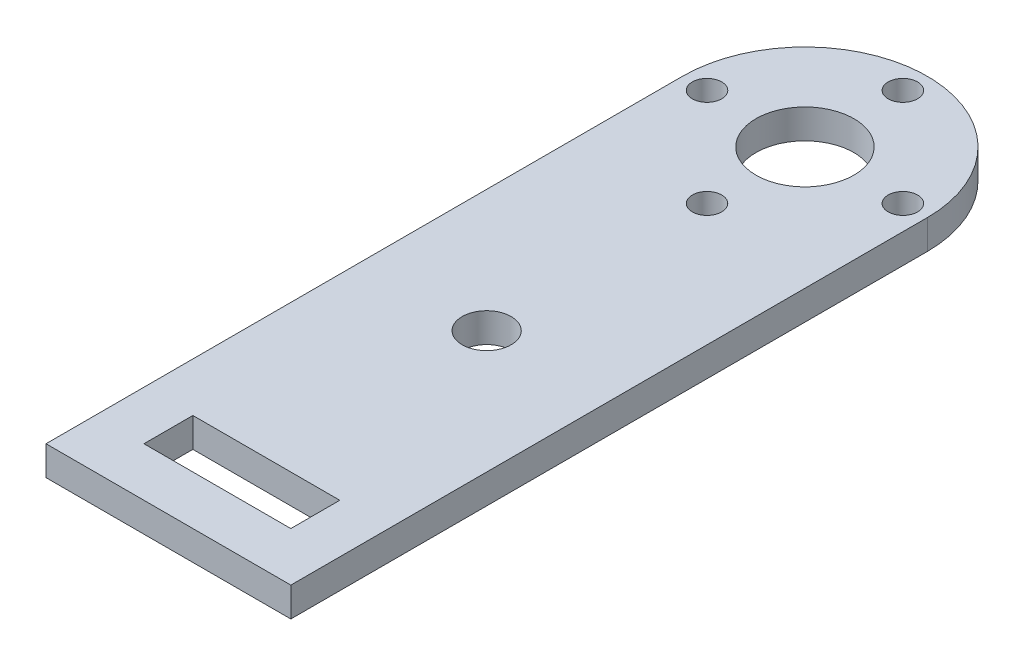
ISO-10303-21;
HEADER;
FILE_DESCRIPTION(('STEP AP214'),'2;1');
FILE_NAME('part.step','',(''),(''),'','','');
FILE_SCHEMA(('AUTOMOTIVE_DESIGN { 1 0 10303 214 1 1 1 1 }'));
ENDSEC;
DATA;
#1=APPLICATION_CONTEXT('core data for automotive mechanical design processes');
#2=APPLICATION_PROTOCOL_DEFINITION('international standard','automotive_design',2000,#1);
#3=PRODUCT_CONTEXT('',#1,'mechanical');
#4=PRODUCT('Part','Part','',(#3));
#5=PRODUCT_RELATED_PRODUCT_CATEGORY('part','',(#4));
#6=PRODUCT_DEFINITION_FORMATION('','',#4);
#7=PRODUCT_DEFINITION_CONTEXT('part definition',#1,'design');
#8=PRODUCT_DEFINITION('design','',#6,#7);
#9=PRODUCT_DEFINITION_SHAPE('','',#8);
#10=(LENGTH_UNIT() NAMED_UNIT(*) SI_UNIT(.MILLI.,.METRE.));
#11=(NAMED_UNIT(*) PLANE_ANGLE_UNIT() SI_UNIT($,.RADIAN.));
#12=(NAMED_UNIT(*) SI_UNIT($,.STERADIAN.) SOLID_ANGLE_UNIT());
#13=UNCERTAINTY_MEASURE_WITH_UNIT(LENGTH_MEASURE(1.E-05),#10,'distance_accuracy_value','');
#14=(GEOMETRIC_REPRESENTATION_CONTEXT(3) GLOBAL_UNCERTAINTY_ASSIGNED_CONTEXT((#13)) GLOBAL_UNIT_ASSIGNED_CONTEXT((#10,
#11,#12)) REPRESENTATION_CONTEXT('',''));
#15=CARTESIAN_POINT('',(0.,0.,0.));
#16=DIRECTION('',(0.,0.,1.));
#17=DIRECTION('',(1.,0.,0.));
#18=AXIS2_PLACEMENT_3D('',#15,#16,#17);
#19=CARTESIAN_POINT('',(1.25,0.3,-6.5));
#20=DIRECTION('',(0.,-1.,0.));
#21=DIRECTION('',(0.,0.,-1.));
#22=AXIS2_PLACEMENT_3D('',#19,#20,#21);
#23=PLANE('',#22);
#24=CARTESIAN_POINT('',(1.25,0.3,-3.25));
#25=DIRECTION('',(0.,1.,0.));
#26=DIRECTION('',(0.,0.,1.));
#27=AXIS2_PLACEMENT_3D('',#24,#25,#26);
#28=CIRCLE('',#27,0.25);
#29=CARTESIAN_POINT('',(1.25,0.3,-3.));
#30=VERTEX_POINT('',#29);
#31=EDGE_CURVE('E259',#30,#30,#28,.T.);
#32=ORIENTED_EDGE('',*,*,#31,.F.);
#33=EDGE_LOOP('',(#32));
#34=FACE_BOUND('',#33,.T.);
#35=CARTESIAN_POINT('',(1.24999999999999,0.3,-7.5));
#36=DIRECTION('',(0.,1.,0.));
#37=DIRECTION('',(-1.,0.,0.));
#38=AXIS2_PLACEMENT_3D('',#35,#36,#37);
#39=CIRCLE('',#38,0.15);
#40=CARTESIAN_POINT('',(1.09999999999999,0.3,-7.5));
#41=VERTEX_POINT('',#40);
#42=EDGE_CURVE('E261',#41,#41,#39,.T.);
#43=ORIENTED_EDGE('',*,*,#42,.F.);
#44=EDGE_LOOP('',(#43));
#45=FACE_BOUND('',#44,.T.);
#46=CARTESIAN_POINT('',(2.25,0.3,-6.5));
#47=DIRECTION('',(0.,1.,0.));
#48=DIRECTION('',(0.,0.,-1.));
#49=AXIS2_PLACEMENT_3D('',#46,#47,#48);
#50=CIRCLE('',#49,0.15);
#51=CARTESIAN_POINT('',(2.25,0.3,-6.65));
#52=VERTEX_POINT('',#51);
#53=EDGE_CURVE('E267',#52,#52,#50,.T.);
#54=ORIENTED_EDGE('',*,*,#53,.F.);
#55=EDGE_LOOP('',(#54));
#56=FACE_BOUND('',#55,.T.);
#57=CARTESIAN_POINT('',(1.25,0.3,-5.5));
#58=DIRECTION('',(0.,1.,0.));
#59=DIRECTION('',(1.,0.,0.));
#60=AXIS2_PLACEMENT_3D('',#57,#58,#59);
#61=CIRCLE('',#60,0.15);
#62=CARTESIAN_POINT('',(1.4,0.3,-5.5));
#63=VERTEX_POINT('',#62);
#64=EDGE_CURVE('E273',#63,#63,#61,.T.);
#65=ORIENTED_EDGE('',*,*,#64,.F.);
#66=EDGE_LOOP('',(#65));
#67=FACE_BOUND('',#66,.T.);
#68=CARTESIAN_POINT('',(0.25,0.3,-6.5));
#69=DIRECTION('',(0.,1.,0.));
#70=DIRECTION('',(0.,0.,1.));
#71=AXIS2_PLACEMENT_3D('',#68,#69,#70);
#72=CIRCLE('',#71,0.15);
#73=CARTESIAN_POINT('',(0.25,0.3,-6.35));
#74=VERTEX_POINT('',#73);
#75=EDGE_CURVE('E279',#74,#74,#72,.T.);
#76=ORIENTED_EDGE('',*,*,#75,.F.);
#77=EDGE_LOOP('',(#76));
#78=FACE_BOUND('',#77,.T.);
#79=CARTESIAN_POINT('',(1.25,0.3,-6.5));
#80=DIRECTION('',(0.,1.,0.));
#81=DIRECTION('',(0.,0.,1.));
#82=AXIS2_PLACEMENT_3D('',#79,#80,#81);
#83=CIRCLE('',#82,0.5);
#84=CARTESIAN_POINT('',(1.25,0.3,-6.));
#85=VERTEX_POINT('',#84);
#86=EDGE_CURVE('E138',#85,#85,#83,.T.);
#87=ORIENTED_EDGE('',*,*,#86,.F.);
#88=EDGE_LOOP('',(#87));
#89=FACE_BOUND('',#88,.T.);
#90=DIRECTION('',(0.,0.,1.));
#91=VECTOR('',#90,1.);
#92=CARTESIAN_POINT('',(0.,0.3,0.));
#93=LINE('',#92,#91);
#94=CARTESIAN_POINT('',(0.,0.3,-6.5));
#95=VERTEX_POINT('',#94);
#96=CARTESIAN_POINT('',(0.,0.3,0.));
#97=VERTEX_POINT('',#96);
#98=EDGE_CURVE('E144',#95,#97,#93,.T.);
#99=ORIENTED_EDGE('',*,*,#98,.T.);
#100=DIRECTION('',(1.,0.,0.));
#101=VECTOR('',#100,1.);
#102=CARTESIAN_POINT('',(0.,0.3,0.));
#103=LINE('',#102,#101);
#104=CARTESIAN_POINT('',(2.5,0.3,0.));
#105=VERTEX_POINT('',#104);
#106=EDGE_CURVE('E147',#97,#105,#103,.T.);
#107=ORIENTED_EDGE('',*,*,#106,.T.);
#108=DIRECTION('',(0.,0.,-1.));
#109=VECTOR('',#108,1.);
#110=CARTESIAN_POINT('',(2.5,0.3,0.));
#111=LINE('',#110,#109);
#112=CARTESIAN_POINT('',(2.5,0.3,-6.5));
#113=VERTEX_POINT('',#112);
#114=EDGE_CURVE('E150',#105,#113,#111,.T.);
#115=ORIENTED_EDGE('',*,*,#114,.T.);
#116=CARTESIAN_POINT('',(1.25,0.3,-6.5));
#117=DIRECTION('',(0.,1.,0.));
#118=DIRECTION('',(0.,0.,-1.));
#119=AXIS2_PLACEMENT_3D('',#116,#117,#118);
#120=CIRCLE('',#119,1.25);
#121=EDGE_CURVE('E152',#113,#95,#120,.T.);
#122=ORIENTED_EDGE('',*,*,#121,.T.);
#123=EDGE_LOOP('',(#99,#107,#115,#122));
#124=FACE_BOUND('',#123,.T.);
#125=DIRECTION('',(0.,0.,1.));
#126=VECTOR('',#125,1.);
#127=CARTESIAN_POINT('',(0.5,0.3,-0.5));
#128=LINE('',#127,#126);
#129=CARTESIAN_POINT('',(0.5,0.3,-1.));
#130=VERTEX_POINT('',#129);
#131=CARTESIAN_POINT('',(0.5,0.3,-0.5));
#132=VERTEX_POINT('',#131);
#133=EDGE_CURVE('E100',#130,#132,#128,.T.);
#134=ORIENTED_EDGE('',*,*,#133,.F.);
#135=DIRECTION('',(-1.,0.,0.));
#136=VECTOR('',#135,1.);
#137=CARTESIAN_POINT('',(2.,0.3,-1.));
#138=LINE('',#137,#136);
#139=CARTESIAN_POINT('',(2.,0.3,-1.));
#140=VERTEX_POINT('',#139);
#141=EDGE_CURVE('E122',#140,#130,#138,.T.);
#142=ORIENTED_EDGE('',*,*,#141,.F.);
#143=DIRECTION('',(0.,0.,-1.));
#144=VECTOR('',#143,1.);
#145=CARTESIAN_POINT('',(2.,0.3,-0.5));
#146=LINE('',#145,#144);
#147=CARTESIAN_POINT('',(2.,0.3,-0.5));
#148=VERTEX_POINT('',#147);
#149=EDGE_CURVE('E120',#148,#140,#146,.T.);
#150=ORIENTED_EDGE('',*,*,#149,.F.);
#151=DIRECTION('',(1.,0.,0.));
#152=VECTOR('',#151,1.);
#153=CARTESIAN_POINT('',(2.,0.3,-0.5));
#154=LINE('',#153,#152);
#155=EDGE_CURVE('E108',#132,#148,#154,.T.);
#156=ORIENTED_EDGE('',*,*,#155,.F.);
#157=EDGE_LOOP('',(#134,#142,#150,#156));
#158=FACE_BOUND('',#157,.T.);
#159=ADVANCED_FACE('F35',(#34,#45,#56,#67,#78,#89,#124,#158),#23,.F.);
#160=CARTESIAN_POINT('',(1.25,0.,-6.5));
#161=DIRECTION('',(0.,-1.,0.));
#162=DIRECTION('',(0.,0.,-1.));
#163=AXIS2_PLACEMENT_3D('',#160,#161,#162);
#164=PLANE('',#163);
#165=CARTESIAN_POINT('',(1.25,0.,-3.25));
#166=DIRECTION('',(0.,1.,0.));
#167=DIRECTION('',(0.,0.,1.));
#168=AXIS2_PLACEMENT_3D('',#165,#166,#167);
#169=CIRCLE('',#168,0.25);
#170=CARTESIAN_POINT('',(1.25,0.,-3.));
#171=VERTEX_POINT('',#170);
#172=EDGE_CURVE('E257',#171,#171,#169,.T.);
#173=ORIENTED_EDGE('',*,*,#172,.T.);
#174=EDGE_LOOP('',(#173));
#175=FACE_BOUND('',#174,.T.);
#176=CARTESIAN_POINT('',(1.24999999999999,0.,-7.5));
#177=DIRECTION('',(0.,1.,0.));
#178=DIRECTION('',(-1.,0.,0.));
#179=AXIS2_PLACEMENT_3D('',#176,#177,#178);
#180=CIRCLE('',#179,0.15);
#181=CARTESIAN_POINT('',(1.09999999999999,0.,-7.5));
#182=VERTEX_POINT('',#181);
#183=EDGE_CURVE('E264',#182,#182,#180,.T.);
#184=ORIENTED_EDGE('',*,*,#183,.T.);
#185=EDGE_LOOP('',(#184));
#186=FACE_BOUND('',#185,.T.);
#187=CARTESIAN_POINT('',(2.25,0.,-6.5));
#188=DIRECTION('',(0.,1.,0.));
#189=DIRECTION('',(0.,0.,-1.));
#190=AXIS2_PLACEMENT_3D('',#187,#188,#189);
#191=CIRCLE('',#190,0.15);
#192=CARTESIAN_POINT('',(2.25,0.,-6.65));
#193=VERTEX_POINT('',#192);
#194=EDGE_CURVE('E270',#193,#193,#191,.T.);
#195=ORIENTED_EDGE('',*,*,#194,.T.);
#196=EDGE_LOOP('',(#195));
#197=FACE_BOUND('',#196,.T.);
#198=CARTESIAN_POINT('',(1.25,0.,-5.5));
#199=DIRECTION('',(0.,1.,0.));
#200=DIRECTION('',(1.,0.,0.));
#201=AXIS2_PLACEMENT_3D('',#198,#199,#200);
#202=CIRCLE('',#201,0.15);
#203=CARTESIAN_POINT('',(1.4,0.,-5.5));
#204=VERTEX_POINT('',#203);
#205=EDGE_CURVE('E276',#204,#204,#202,.T.);
#206=ORIENTED_EDGE('',*,*,#205,.T.);
#207=EDGE_LOOP('',(#206));
#208=FACE_BOUND('',#207,.T.);
#209=CARTESIAN_POINT('',(0.25,0.,-6.5));
#210=DIRECTION('',(0.,1.,0.));
#211=DIRECTION('',(0.,0.,1.));
#212=AXIS2_PLACEMENT_3D('',#209,#210,#211);
#213=CIRCLE('',#212,0.15);
#214=CARTESIAN_POINT('',(0.25,0.,-6.35));
#215=VERTEX_POINT('',#214);
#216=EDGE_CURVE('E128',#215,#215,#213,.T.);
#217=ORIENTED_EDGE('',*,*,#216,.T.);
#218=EDGE_LOOP('',(#217));
#219=FACE_BOUND('',#218,.T.);
#220=CARTESIAN_POINT('',(1.25,0.,-6.5));
#221=DIRECTION('',(0.,1.,0.));
#222=DIRECTION('',(0.,0.,1.));
#223=AXIS2_PLACEMENT_3D('',#220,#221,#222);
#224=CIRCLE('',#223,0.5);
#225=CARTESIAN_POINT('',(1.25,0.,-6.));
#226=VERTEX_POINT('',#225);
#227=EDGE_CURVE('E116',#226,#226,#224,.T.);
#228=ORIENTED_EDGE('',*,*,#227,.T.);
#229=EDGE_LOOP('',(#228));
#230=FACE_BOUND('',#229,.T.);
#231=DIRECTION('',(0.,0.,1.));
#232=VECTOR('',#231,1.);
#233=CARTESIAN_POINT('',(0.,0.,0.));
#234=LINE('',#233,#232);
#235=CARTESIAN_POINT('',(0.,0.,-6.5));
#236=VERTEX_POINT('',#235);
#237=CARTESIAN_POINT('',(0.,0.,0.));
#238=VERTEX_POINT('',#237);
#239=EDGE_CURVE('E141',#236,#238,#234,.T.);
#240=ORIENTED_EDGE('',*,*,#239,.F.);
#241=CARTESIAN_POINT('',(1.25,0.,-6.5));
#242=DIRECTION('',(0.,1.,0.));
#243=DIRECTION('',(0.,0.,-1.));
#244=AXIS2_PLACEMENT_3D('',#241,#242,#243);
#245=CIRCLE('',#244,1.25);
#246=CARTESIAN_POINT('',(2.5,0.,-6.5));
#247=VERTEX_POINT('',#246);
#248=EDGE_CURVE('E148',#247,#236,#245,.T.);
#249=ORIENTED_EDGE('',*,*,#248,.F.);
#250=DIRECTION('',(0.,0.,-1.));
#251=VECTOR('',#250,1.);
#252=CARTESIAN_POINT('',(2.5,0.,0.));
#253=LINE('',#252,#251);
#254=CARTESIAN_POINT('',(2.5,0.,0.));
#255=VERTEX_POINT('',#254);
#256=EDGE_CURVE('E159',#255,#247,#253,.T.);
#257=ORIENTED_EDGE('',*,*,#256,.F.);
#258=DIRECTION('',(1.,0.,0.));
#259=VECTOR('',#258,1.);
#260=CARTESIAN_POINT('',(0.,0.,0.));
#261=LINE('',#260,#259);
#262=EDGE_CURVE('E157',#238,#255,#261,.T.);
#263=ORIENTED_EDGE('',*,*,#262,.F.);
#264=EDGE_LOOP('',(#240,#249,#257,#263));
#265=FACE_BOUND('',#264,.T.);
#266=DIRECTION('',(-1.,0.,0.));
#267=VECTOR('',#266,1.);
#268=CARTESIAN_POINT('',(2.,0.,-1.));
#269=LINE('',#268,#267);
#270=CARTESIAN_POINT('',(2.,0.,-1.));
#271=VERTEX_POINT('',#270);
#272=CARTESIAN_POINT('',(0.5,0.,-1.));
#273=VERTEX_POINT('',#272);
#274=EDGE_CURVE('E109',#271,#273,#269,.T.);
#275=ORIENTED_EDGE('',*,*,#274,.T.);
#276=DIRECTION('',(0.,0.,1.));
#277=VECTOR('',#276,1.);
#278=CARTESIAN_POINT('',(0.5,0.,-0.5));
#279=LINE('',#278,#277);
#280=CARTESIAN_POINT('',(0.5,0.,-0.5));
#281=VERTEX_POINT('',#280);
#282=EDGE_CURVE('E58',#273,#281,#279,.T.);
#283=ORIENTED_EDGE('',*,*,#282,.T.);
#284=DIRECTION('',(1.,0.,0.));
#285=VECTOR('',#284,1.);
#286=CARTESIAN_POINT('',(2.,0.,-0.5));
#287=LINE('',#286,#285);
#288=CARTESIAN_POINT('',(2.,0.,-0.5));
#289=VERTEX_POINT('',#288);
#290=EDGE_CURVE('E115',#281,#289,#287,.T.);
#291=ORIENTED_EDGE('',*,*,#290,.T.);
#292=DIRECTION('',(0.,0.,-1.));
#293=VECTOR('',#292,1.);
#294=CARTESIAN_POINT('',(2.,0.,-0.5));
#295=LINE('',#294,#293);
#296=EDGE_CURVE('E130',#289,#271,#295,.T.);
#297=ORIENTED_EDGE('',*,*,#296,.T.);
#298=EDGE_LOOP('',(#275,#283,#291,#297));
#299=FACE_BOUND('',#298,.T.);
#300=ADVANCED_FACE('F177',(#175,#186,#197,#208,#219,#230,#265,#299),#164,.T.);
#301=CARTESIAN_POINT('',(0.,0.3,0.));
#302=DIRECTION('',(1.,0.,0.));
#303=DIRECTION('',(0.,0.,-1.));
#304=AXIS2_PLACEMENT_3D('',#301,#302,#303);
#305=PLANE('',#304);
#306=ORIENTED_EDGE('',*,*,#239,.T.);
#307=DIRECTION('',(0.,-1.,0.));
#308=VECTOR('',#307,1.);
#309=CARTESIAN_POINT('',(0.,0.3,0.));
#310=LINE('',#309,#308);
#311=EDGE_CURVE('E11',#97,#238,#310,.T.);
#312=ORIENTED_EDGE('',*,*,#311,.F.);
#313=ORIENTED_EDGE('',*,*,#98,.F.);
#314=DIRECTION('',(0.,-1.,0.));
#315=VECTOR('',#314,1.);
#316=CARTESIAN_POINT('',(0.,0.3,-6.5));
#317=LINE('',#316,#315);
#318=EDGE_CURVE('E154',#95,#236,#317,.T.);
#319=ORIENTED_EDGE('',*,*,#318,.T.);
#320=EDGE_LOOP('',(#306,#312,#313,#319));
#321=FACE_BOUND('',#320,.T.);
#322=ADVANCED_FACE('F37',(#321),#305,.F.);
#323=CARTESIAN_POINT('',(0.,0.3,0.));
#324=DIRECTION('',(0.,0.,-1.));
#325=DIRECTION('',(-1.,0.,0.));
#326=AXIS2_PLACEMENT_3D('',#323,#324,#325);
#327=PLANE('',#326);
#328=ORIENTED_EDGE('',*,*,#262,.T.);
#329=DIRECTION('',(0.,-1.,0.));
#330=VECTOR('',#329,1.);
#331=CARTESIAN_POINT('',(2.5,0.3,0.));
#332=LINE('',#331,#330);
#333=EDGE_CURVE('E43',#105,#255,#332,.T.);
#334=ORIENTED_EDGE('',*,*,#333,.F.);
#335=ORIENTED_EDGE('',*,*,#106,.F.);
#336=ORIENTED_EDGE('',*,*,#311,.T.);
#337=EDGE_LOOP('',(#328,#334,#335,#336));
#338=FACE_BOUND('',#337,.T.);
#339=ADVANCED_FACE('F187',(#338),#327,.F.);
#340=CARTESIAN_POINT('',(2.5,0.3,0.));
#341=DIRECTION('',(-1.,0.,0.));
#342=DIRECTION('',(0.,0.,1.));
#343=AXIS2_PLACEMENT_3D('',#340,#341,#342);
#344=PLANE('',#343);
#345=ORIENTED_EDGE('',*,*,#256,.T.);
#346=DIRECTION('',(0.,-1.,0.));
#347=VECTOR('',#346,1.);
#348=CARTESIAN_POINT('',(2.5,0.3,-6.5));
#349=LINE('',#348,#347);
#350=EDGE_CURVE('E164',#113,#247,#349,.T.);
#351=ORIENTED_EDGE('',*,*,#350,.F.);
#352=ORIENTED_EDGE('',*,*,#114,.F.);
#353=ORIENTED_EDGE('',*,*,#333,.T.);
#354=EDGE_LOOP('',(#345,#351,#352,#353));
#355=FACE_BOUND('',#354,.T.);
#356=ADVANCED_FACE('F171',(#355),#344,.F.);
#357=CARTESIAN_POINT('',(1.25,0.3,-6.5));
#358=DIRECTION('',(0.,-1.,0.));
#359=DIRECTION('',(0.,0.,-1.));
#360=AXIS2_PLACEMENT_3D('',#357,#358,#359);
#361=CYLINDRICAL_SURFACE('',#360,1.25);
#362=ORIENTED_EDGE('',*,*,#248,.T.);
#363=ORIENTED_EDGE('',*,*,#318,.F.);
#364=ORIENTED_EDGE('',*,*,#121,.F.);
#365=ORIENTED_EDGE('',*,*,#350,.T.);
#366=EDGE_LOOP('',(#362,#363,#364,#365));
#367=FACE_BOUND('',#366,.T.);
#368=ADVANCED_FACE('F181',(#367),#361,.T.);
#369=CARTESIAN_POINT('',(1.25,0.3,-6.5));
#370=DIRECTION('',(0.,-1.,0.));
#371=DIRECTION('',(0.,0.,-1.));
#372=AXIS2_PLACEMENT_3D('',#369,#370,#371);
#373=CYLINDRICAL_SURFACE('',#372,0.5);
#374=ORIENTED_EDGE('',*,*,#86,.T.);
#375=EDGE_LOOP('',(#374));
#376=FACE_BOUND('',#375,.T.);
#377=ORIENTED_EDGE('',*,*,#227,.F.);
#378=EDGE_LOOP('',(#377));
#379=FACE_BOUND('',#378,.T.);
#380=ADVANCED_FACE('F205',(#376,#379),#373,.F.);
#381=CARTESIAN_POINT('',(0.5,0.3,-0.5));
#382=DIRECTION('',(1.,0.,0.));
#383=DIRECTION('',(0.,0.,-1.));
#384=AXIS2_PLACEMENT_3D('',#381,#382,#383);
#385=PLANE('',#384);
#386=ORIENTED_EDGE('',*,*,#282,.F.);
#387=DIRECTION('',(0.,-1.,0.));
#388=VECTOR('',#387,1.);
#389=CARTESIAN_POINT('',(0.5,0.3,-1.));
#390=LINE('',#389,#388);
#391=EDGE_CURVE('E104',#130,#273,#390,.T.);
#392=ORIENTED_EDGE('',*,*,#391,.F.);
#393=ORIENTED_EDGE('',*,*,#133,.T.);
#394=DIRECTION('',(0.,-1.,0.));
#395=VECTOR('',#394,1.);
#396=CARTESIAN_POINT('',(0.5,0.3,-0.5));
#397=LINE('',#396,#395);
#398=EDGE_CURVE('E103',#132,#281,#397,.T.);
#399=ORIENTED_EDGE('',*,*,#398,.T.);
#400=EDGE_LOOP('',(#386,#392,#393,#399));
#401=FACE_BOUND('',#400,.T.);
#402=ADVANCED_FACE('F102',(#401),#385,.T.);
#403=CARTESIAN_POINT('',(2.,0.3,-0.5));
#404=DIRECTION('',(0.,0.,-1.));
#405=DIRECTION('',(-1.,0.,0.));
#406=AXIS2_PLACEMENT_3D('',#403,#404,#405);
#407=PLANE('',#406);
#408=ORIENTED_EDGE('',*,*,#290,.F.);
#409=ORIENTED_EDGE('',*,*,#398,.F.);
#410=ORIENTED_EDGE('',*,*,#155,.T.);
#411=DIRECTION('',(0.,-1.,0.));
#412=VECTOR('',#411,1.);
#413=CARTESIAN_POINT('',(2.,0.3,-0.5));
#414=LINE('',#413,#412);
#415=EDGE_CURVE('E117',#148,#289,#414,.T.);
#416=ORIENTED_EDGE('',*,*,#415,.T.);
#417=EDGE_LOOP('',(#408,#409,#410,#416));
#418=FACE_BOUND('',#417,.T.);
#419=ADVANCED_FACE('F112',(#418),#407,.T.);
#420=CARTESIAN_POINT('',(2.,0.3,-0.5));
#421=DIRECTION('',(-1.,0.,0.));
#422=DIRECTION('',(0.,0.,1.));
#423=AXIS2_PLACEMENT_3D('',#420,#421,#422);
#424=PLANE('',#423);
#425=ORIENTED_EDGE('',*,*,#296,.F.);
#426=ORIENTED_EDGE('',*,*,#415,.F.);
#427=ORIENTED_EDGE('',*,*,#149,.T.);
#428=DIRECTION('',(0.,-1.,0.));
#429=VECTOR('',#428,1.);
#430=CARTESIAN_POINT('',(2.,0.3,-1.));
#431=LINE('',#430,#429);
#432=EDGE_CURVE('E50',#140,#271,#431,.T.);
#433=ORIENTED_EDGE('',*,*,#432,.T.);
#434=EDGE_LOOP('',(#425,#426,#427,#433));
#435=FACE_BOUND('',#434,.T.);
#436=ADVANCED_FACE('F224',(#435),#424,.T.);
#437=CARTESIAN_POINT('',(2.,0.3,-1.));
#438=DIRECTION('',(0.,0.,1.));
#439=DIRECTION('',(1.,0.,0.));
#440=AXIS2_PLACEMENT_3D('',#437,#438,#439);
#441=PLANE('',#440);
#442=ORIENTED_EDGE('',*,*,#274,.F.);
#443=ORIENTED_EDGE('',*,*,#432,.F.);
#444=ORIENTED_EDGE('',*,*,#141,.T.);
#445=ORIENTED_EDGE('',*,*,#391,.T.);
#446=EDGE_LOOP('',(#442,#443,#444,#445));
#447=FACE_BOUND('',#446,.T.);
#448=ADVANCED_FACE('F229',(#447),#441,.T.);
#449=CARTESIAN_POINT('',(0.25,0.,-6.5));
#450=DIRECTION('',(0.,1.,0.));
#451=DIRECTION('',(0.,0.,1.));
#452=AXIS2_PLACEMENT_3D('',#449,#450,#451);
#453=CYLINDRICAL_SURFACE('',#452,0.15);
#454=ORIENTED_EDGE('',*,*,#216,.F.);
#455=EDGE_LOOP('',(#454));
#456=FACE_BOUND('',#455,.T.);
#457=ORIENTED_EDGE('',*,*,#75,.T.);
#458=EDGE_LOOP('',(#457));
#459=FACE_BOUND('',#458,.T.);
#460=ADVANCED_FACE('F233',(#456,#459),#453,.F.);
#461=CARTESIAN_POINT('',(1.25,0.,-5.5));
#462=DIRECTION('',(0.,1.,0.));
#463=DIRECTION('',(0.,0.,1.));
#464=AXIS2_PLACEMENT_3D('',#461,#462,#463);
#465=CYLINDRICAL_SURFACE('',#464,0.15);
#466=ORIENTED_EDGE('',*,*,#205,.F.);
#467=EDGE_LOOP('',(#466));
#468=FACE_BOUND('',#467,.T.);
#469=ORIENTED_EDGE('',*,*,#64,.T.);
#470=EDGE_LOOP('',(#469));
#471=FACE_BOUND('',#470,.T.);
#472=ADVANCED_FACE('F236',(#468,#471),#465,.F.);
#473=CARTESIAN_POINT('',(2.25,0.,-6.5));
#474=DIRECTION('',(0.,1.,0.));
#475=DIRECTION('',(0.,0.,1.));
#476=AXIS2_PLACEMENT_3D('',#473,#474,#475);
#477=CYLINDRICAL_SURFACE('',#476,0.15);
#478=ORIENTED_EDGE('',*,*,#194,.F.);
#479=EDGE_LOOP('',(#478));
#480=FACE_BOUND('',#479,.T.);
#481=ORIENTED_EDGE('',*,*,#53,.T.);
#482=EDGE_LOOP('',(#481));
#483=FACE_BOUND('',#482,.T.);
#484=ADVANCED_FACE('F240',(#480,#483),#477,.F.);
#485=CARTESIAN_POINT('',(1.24999999999999,0.,-7.5));
#486=DIRECTION('',(0.,1.,0.));
#487=DIRECTION('',(0.,0.,1.));
#488=AXIS2_PLACEMENT_3D('',#485,#486,#487);
#489=CYLINDRICAL_SURFACE('',#488,0.15);
#490=ORIENTED_EDGE('',*,*,#183,.F.);
#491=EDGE_LOOP('',(#490));
#492=FACE_BOUND('',#491,.T.);
#493=ORIENTED_EDGE('',*,*,#42,.T.);
#494=EDGE_LOOP('',(#493));
#495=FACE_BOUND('',#494,.T.);
#496=ADVANCED_FACE('F244',(#492,#495),#489,.F.);
#497=CARTESIAN_POINT('',(1.25,0.,-3.25));
#498=DIRECTION('',(0.,1.,0.));
#499=DIRECTION('',(0.,0.,1.));
#500=AXIS2_PLACEMENT_3D('',#497,#498,#499);
#501=CYLINDRICAL_SURFACE('',#500,0.25);
#502=ORIENTED_EDGE('',*,*,#172,.F.);
#503=EDGE_LOOP('',(#502));
#504=FACE_BOUND('',#503,.T.);
#505=ORIENTED_EDGE('',*,*,#31,.T.);
#506=EDGE_LOOP('',(#505));
#507=FACE_BOUND('',#506,.T.);
#508=ADVANCED_FACE('F248',(#504,#507),#501,.F.);
#509=CLOSED_SHELL('',(#159,#300,#322,#339,#356,#368,#380,#402,#419,#436,#448,#460,#472,#484,
#496,#508));
#510=MANIFOLD_SOLID_BREP('B2',#509);
#511=ADVANCED_BREP_SHAPE_REPRESENTATION('',(#18,#510),#14);
#512=SHAPE_DEFINITION_REPRESENTATION(#9,#511);
ENDSEC;
END-ISO-10303-21;
